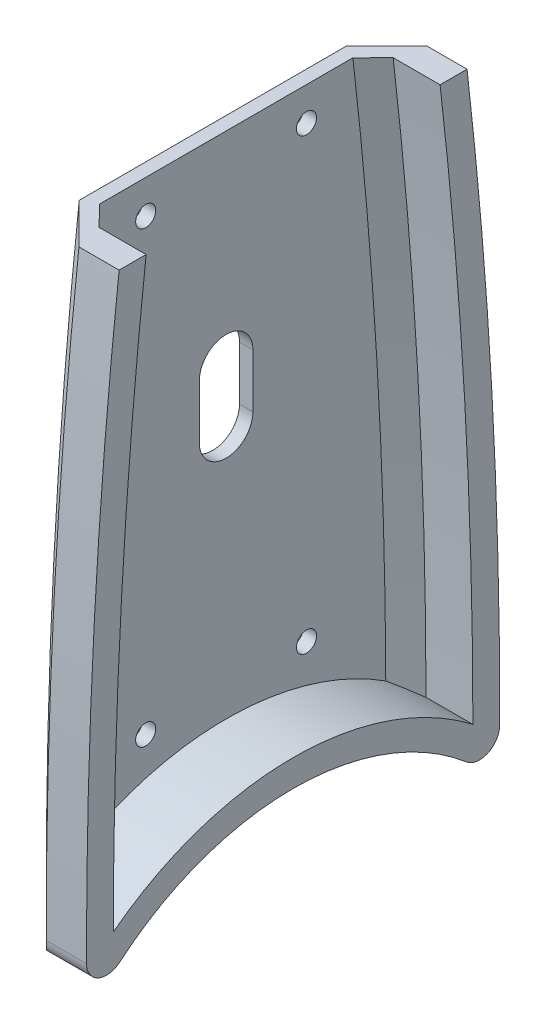
ISO-10303-21;
HEADER;
FILE_DESCRIPTION(('STEP AP214'),'2;1');
FILE_NAME('part.step','',(''),(''),'','','');
FILE_SCHEMA(('AUTOMOTIVE_DESIGN { 1 0 10303 214 1 1 1 1 }'));
ENDSEC;
DATA;
#1=APPLICATION_CONTEXT('core data for automotive mechanical design processes');
#2=APPLICATION_PROTOCOL_DEFINITION('international standard','automotive_design',2000,#1);
#3=PRODUCT_CONTEXT('',#1,'mechanical');
#4=PRODUCT('Part','Part','',(#3));
#5=PRODUCT_RELATED_PRODUCT_CATEGORY('part','',(#4));
#6=PRODUCT_DEFINITION_FORMATION('','',#4);
#7=PRODUCT_DEFINITION_CONTEXT('part definition',#1,'design');
#8=PRODUCT_DEFINITION('design','',#6,#7);
#9=PRODUCT_DEFINITION_SHAPE('','',#8);
#10=(LENGTH_UNIT() NAMED_UNIT(*) SI_UNIT(.MILLI.,.METRE.));
#11=(NAMED_UNIT(*) PLANE_ANGLE_UNIT() SI_UNIT($,.RADIAN.));
#12=(NAMED_UNIT(*) SI_UNIT($,.STERADIAN.) SOLID_ANGLE_UNIT());
#13=UNCERTAINTY_MEASURE_WITH_UNIT(LENGTH_MEASURE(1.E-05),#10,'distance_accuracy_value','');
#14=(GEOMETRIC_REPRESENTATION_CONTEXT(3) GLOBAL_UNCERTAINTY_ASSIGNED_CONTEXT((#13)) GLOBAL_UNIT_ASSIGNED_CONTEXT((#10,
#11,#12)) REPRESENTATION_CONTEXT('',''));
#15=CARTESIAN_POINT('',(0.,0.,0.));
#16=DIRECTION('',(0.,0.,1.));
#17=DIRECTION('',(1.,0.,0.));
#18=AXIS2_PLACEMENT_3D('',#15,#16,#17);
#19=CARTESIAN_POINT('',(2.,34.6875000000001,-719.163943300657));
#20=DIRECTION('',(-1.,0.,0.));
#21=DIRECTION('',(0.,0.,1.));
#22=AXIS2_PLACEMENT_3D('',#19,#20,#21);
#23=PLANE('',#22);
#24=CARTESIAN_POINT('',(2.,48.,-12.));
#25=DIRECTION('',(-1.,0.,0.));
#26=DIRECTION('',(0.,0.,1.));
#27=AXIS2_PLACEMENT_3D('',#24,#25,#26);
#28=CIRCLE('',#27,1.5);
#29=CARTESIAN_POINT('',(2.,48.,-10.5));
#30=VERTEX_POINT('',#29);
#31=EDGE_CURVE('E383',#30,#30,#28,.F.);
#32=ORIENTED_EDGE('',*,*,#31,.F.);
#33=EDGE_LOOP('',(#32));
#34=FACE_BOUND('',#33,.T.);
#35=CARTESIAN_POINT('',(2.,48.,12.));
#36=DIRECTION('',(-1.,0.,0.));
#37=DIRECTION('',(0.,0.,1.));
#38=AXIS2_PLACEMENT_3D('',#35,#36,#37);
#39=CIRCLE('',#38,1.5);
#40=CARTESIAN_POINT('',(2.,48.,13.5));
#41=VERTEX_POINT('',#40);
#42=EDGE_CURVE('E386',#41,#41,#39,.F.);
#43=ORIENTED_EDGE('',*,*,#42,.F.);
#44=EDGE_LOOP('',(#43));
#45=FACE_BOUND('',#44,.T.);
#46=CARTESIAN_POINT('',(2.,0.,0.));
#47=DIRECTION('',(1.,0.,0.));
#48=DIRECTION('',(0.,0.,1.));
#49=AXIS2_PLACEMENT_3D('',#46,#47,#48);
#50=CIRCLE('',#49,44.);
#51=CARTESIAN_POINT('',(2.,36.9866458379439,-23.8324994421171));
#52=VERTEX_POINT('',#51);
#53=CARTESIAN_POINT('',(2.,36.986645837944,23.832499442117));
#54=VERTEX_POINT('',#53);
#55=EDGE_CURVE('E188',#52,#54,#50,.T.);
#56=ORIENTED_EDGE('',*,*,#55,.F.);
#57=CARTESIAN_POINT('',(2.,34.6875000000001,719.163943300657));
#58=DIRECTION('',(-1.,0.,0.));
#59=DIRECTION('',(0.,0.,1.));
#60=AXIS2_PLACEMENT_3D('',#57,#58,#59);
#61=CIRCLE('',#60,743.);
#62=CARTESIAN_POINT('',(2.,120.,-18.9219442109188));
#63=VERTEX_POINT('',#62);
#64=EDGE_CURVE('E461',#52,#63,#61,.F.);
#65=ORIENTED_EDGE('',*,*,#64,.T.);
#66=DIRECTION('',(0.,0.,1.));
#67=VECTOR('',#66,1.);
#68=CARTESIAN_POINT('',(2.,120.,25.9681103272558));
#69=LINE('',#68,#67);
#70=CARTESIAN_POINT('',(2.,120.,18.9219442109186));
#71=VERTEX_POINT('',#70);
#72=EDGE_CURVE('E55',#63,#71,#69,.T.);
#73=ORIENTED_EDGE('',*,*,#72,.T.);
#74=CARTESIAN_POINT('',(2.,34.6875000000001,-719.163943300657));
#75=DIRECTION('',(-1.,0.,0.));
#76=DIRECTION('',(0.,0.,1.));
#77=AXIS2_PLACEMENT_3D('',#74,#75,#76);
#78=CIRCLE('',#77,743.);
#79=EDGE_CURVE('E335',#71,#54,#78,.F.);
#80=ORIENTED_EDGE('',*,*,#79,.T.);
#81=EDGE_LOOP('',(#56,#65,#73,#80));
#82=FACE_BOUND('',#81,.T.);
#83=CARTESIAN_POINT('',(2.,81.7,0.));
#84=DIRECTION('',(1.,0.,0.));
#85=DIRECTION('',(0.,0.,-1.));
#86=AXIS2_PLACEMENT_3D('',#83,#84,#85);
#87=CIRCLE('',#86,4.);
#88=CARTESIAN_POINT('',(2.,81.7,4.));
#89=VERTEX_POINT('',#88);
#90=CARTESIAN_POINT('',(2.,81.7,-4.));
#91=VERTEX_POINT('',#90);
#92=EDGE_CURVE('E205',#89,#91,#87,.T.);
#93=ORIENTED_EDGE('',*,*,#92,.F.);
#94=DIRECTION('',(0.,-1.,0.));
#95=VECTOR('',#94,1.);
#96=CARTESIAN_POINT('',(2.,89.7,4.));
#97=LINE('',#96,#95);
#98=CARTESIAN_POINT('',(2.,89.7,4.));
#99=VERTEX_POINT('',#98);
#100=EDGE_CURVE('E196',#99,#89,#97,.T.);
#101=ORIENTED_EDGE('',*,*,#100,.F.);
#102=CARTESIAN_POINT('',(2.,89.7,0.));
#103=DIRECTION('',(1.,0.,0.));
#104=DIRECTION('',(0.,0.,-1.));
#105=AXIS2_PLACEMENT_3D('',#102,#103,#104);
#106=CIRCLE('',#105,4.);
#107=CARTESIAN_POINT('',(2.,89.7,-4.));
#108=VERTEX_POINT('',#107);
#109=EDGE_CURVE('E193',#108,#99,#106,.T.);
#110=ORIENTED_EDGE('',*,*,#109,.F.);
#111=DIRECTION('',(0.,1.,0.));
#112=VECTOR('',#111,1.);
#113=CARTESIAN_POINT('',(2.,89.7,-4.));
#114=LINE('',#113,#112);
#115=EDGE_CURVE('E202',#91,#108,#114,.T.);
#116=ORIENTED_EDGE('',*,*,#115,.F.);
#117=EDGE_LOOP('',(#93,#101,#110,#116));
#118=FACE_BOUND('',#117,.T.);
#119=CARTESIAN_POINT('',(2.,115.,12.));
#120=DIRECTION('',(1.,0.,0.));
#121=DIRECTION('',(0.,0.,-1.));
#122=AXIS2_PLACEMENT_3D('',#119,#120,#121);
#123=CIRCLE('',#122,1.5);
#124=CARTESIAN_POINT('',(2.,115.,10.5));
#125=VERTEX_POINT('',#124);
#126=EDGE_CURVE('E237',#125,#125,#123,.T.);
#127=ORIENTED_EDGE('',*,*,#126,.F.);
#128=EDGE_LOOP('',(#127));
#129=FACE_BOUND('',#128,.T.);
#130=CARTESIAN_POINT('',(2.,115.,-12.));
#131=DIRECTION('',(1.,0.,0.));
#132=DIRECTION('',(0.,0.,-1.));
#133=AXIS2_PLACEMENT_3D('',#130,#131,#132);
#134=CIRCLE('',#133,1.5);
#135=CARTESIAN_POINT('',(2.,115.,-13.5));
#136=VERTEX_POINT('',#135);
#137=EDGE_CURVE('E231',#136,#136,#134,.T.);
#138=ORIENTED_EDGE('',*,*,#137,.F.);
#139=EDGE_LOOP('',(#138));
#140=FACE_BOUND('',#139,.T.);
#141=ADVANCED_FACE('F34',(#34,#45,#82,#118,#129,#140),#23,.F.);
#142=CARTESIAN_POINT('',(0.,34.6875000000001,-719.163943300657));
#143=DIRECTION('',(-1.,0.,0.));
#144=DIRECTION('',(0.,0.,1.));
#145=AXIS2_PLACEMENT_3D('',#142,#143,#144);
#146=PLANE('',#145);
#147=CARTESIAN_POINT('',(0.,48.,-12.));
#148=DIRECTION('',(-1.,0.,0.));
#149=DIRECTION('',(0.,0.,1.));
#150=AXIS2_PLACEMENT_3D('',#147,#148,#149);
#151=CIRCLE('',#150,1.5);
#152=CARTESIAN_POINT('',(0.,48.,-10.5));
#153=VERTEX_POINT('',#152);
#154=EDGE_CURVE('E487',#153,#153,#151,.T.);
#155=ORIENTED_EDGE('',*,*,#154,.F.);
#156=EDGE_LOOP('',(#155));
#157=FACE_BOUND('',#156,.T.);
#158=CARTESIAN_POINT('',(0.,48.,12.));
#159=DIRECTION('',(-1.,0.,0.));
#160=DIRECTION('',(0.,0.,1.));
#161=AXIS2_PLACEMENT_3D('',#158,#159,#160);
#162=CIRCLE('',#161,1.5);
#163=CARTESIAN_POINT('',(0.,48.,13.5));
#164=VERTEX_POINT('',#163);
#165=EDGE_CURVE('E488',#164,#164,#162,.T.);
#166=ORIENTED_EDGE('',*,*,#165,.F.);
#167=EDGE_LOOP('',(#166));
#168=FACE_BOUND('',#167,.T.);
#169=DIRECTION('',(0.,-1.,0.));
#170=VECTOR('',#169,1.);
#171=CARTESIAN_POINT('',(0.,89.7,4.));
#172=LINE('',#171,#170);
#173=CARTESIAN_POINT('',(0.,89.7,4.));
#174=VERTEX_POINT('',#173);
#175=CARTESIAN_POINT('',(0.,81.7,4.));
#176=VERTEX_POINT('',#175);
#177=EDGE_CURVE('E204',#174,#176,#172,.T.);
#178=ORIENTED_EDGE('',*,*,#177,.T.);
#179=CARTESIAN_POINT('',(0.,81.7,0.));
#180=DIRECTION('',(-1.,0.,0.));
#181=DIRECTION('',(0.,0.,1.));
#182=AXIS2_PLACEMENT_3D('',#179,#180,#181);
#183=CIRCLE('',#182,4.);
#184=CARTESIAN_POINT('',(0.,81.7,-4.));
#185=VERTEX_POINT('',#184);
#186=EDGE_CURVE('E222',#176,#185,#183,.F.);
#187=ORIENTED_EDGE('',*,*,#186,.T.);
#188=DIRECTION('',(0.,1.,0.));
#189=VECTOR('',#188,1.);
#190=CARTESIAN_POINT('',(0.,89.7,-4.));
#191=LINE('',#190,#189);
#192=CARTESIAN_POINT('',(0.,89.7,-4.));
#193=VERTEX_POINT('',#192);
#194=EDGE_CURVE('E218',#185,#193,#191,.T.);
#195=ORIENTED_EDGE('',*,*,#194,.T.);
#196=CARTESIAN_POINT('',(0.,89.7,0.));
#197=DIRECTION('',(-1.,0.,0.));
#198=DIRECTION('',(0.,0.,1.));
#199=AXIS2_PLACEMENT_3D('',#196,#197,#198);
#200=CIRCLE('',#199,4.);
#201=EDGE_CURVE('E213',#193,#174,#200,.F.);
#202=ORIENTED_EDGE('',*,*,#201,.T.);
#203=EDGE_LOOP('',(#178,#187,#195,#202));
#204=FACE_BOUND('',#203,.T.);
#205=CARTESIAN_POINT('',(0.,115.,12.));
#206=DIRECTION('',(1.,0.,0.));
#207=DIRECTION('',(0.,0.,-1.));
#208=AXIS2_PLACEMENT_3D('',#205,#206,#207);
#209=CIRCLE('',#208,1.5);
#210=CARTESIAN_POINT('',(0.,115.,10.5));
#211=VERTEX_POINT('',#210);
#212=EDGE_CURVE('E234',#211,#211,#209,.T.);
#213=ORIENTED_EDGE('',*,*,#212,.T.);
#214=EDGE_LOOP('',(#213));
#215=FACE_BOUND('',#214,.T.);
#216=DIRECTION('',(0.,0.,1.));
#217=VECTOR('',#216,1.);
#218=CARTESIAN_POINT('',(0.,120.,25.9681103272558));
#219=LINE('',#218,#217);
#220=CARTESIAN_POINT('',(0.,120.,-19.9285930868716));
#221=VERTEX_POINT('',#220);
#222=CARTESIAN_POINT('',(0.,120.,19.9285930868714));
#223=VERTEX_POINT('',#222);
#224=EDGE_CURVE('E245',#221,#223,#219,.T.);
#225=ORIENTED_EDGE('',*,*,#224,.F.);
#226=CARTESIAN_POINT('',(0.,34.6875000000001,719.163943300657));
#227=DIRECTION('',(-1.,0.,0.));
#228=DIRECTION('',(0.,0.,1.));
#229=AXIS2_PLACEMENT_3D('',#226,#227,#228);
#230=CIRCLE('',#229,744.);
#231=CARTESIAN_POINT('',(0.,31.3614337611449,-24.8286220408086));
#232=VERTEX_POINT('',#231);
#233=EDGE_CURVE('E408',#221,#232,#230,.T.);
#234=ORIENTED_EDGE('',*,*,#233,.T.);
#235=CARTESIAN_POINT('',(0.,0.,0.));
#236=DIRECTION('',(-1.,0.,0.));
#237=DIRECTION('',(0.,0.,1.));
#238=AXIS2_PLACEMENT_3D('',#235,#236,#237);
#239=CIRCLE('',#238,40.);
#240=CARTESIAN_POINT('',(0.,31.361433761145,24.8286220408084));
#241=VERTEX_POINT('',#240);
#242=EDGE_CURVE('E240',#241,#232,#239,.T.);
#243=ORIENTED_EDGE('',*,*,#242,.F.);
#244=CARTESIAN_POINT('',(0.,34.6875000000001,-719.163943300657));
#245=DIRECTION('',(-1.,0.,0.));
#246=DIRECTION('',(0.,0.,1.));
#247=AXIS2_PLACEMENT_3D('',#244,#245,#246);
#248=CIRCLE('',#247,744.);
#249=EDGE_CURVE('E410',#241,#223,#248,.T.);
#250=ORIENTED_EDGE('',*,*,#249,.T.);
#251=EDGE_LOOP('',(#225,#234,#243,#250));
#252=FACE_BOUND('',#251,.T.);
#253=CARTESIAN_POINT('',(0.,115.,-12.));
#254=DIRECTION('',(1.,0.,0.));
#255=DIRECTION('',(0.,0.,-1.));
#256=AXIS2_PLACEMENT_3D('',#253,#254,#255);
#257=CIRCLE('',#256,1.5);
#258=CARTESIAN_POINT('',(0.,115.,-13.5));
#259=VERTEX_POINT('',#258);
#260=EDGE_CURVE('E230',#259,#259,#257,.T.);
#261=ORIENTED_EDGE('',*,*,#260,.T.);
#262=EDGE_LOOP('',(#261));
#263=FACE_BOUND('',#262,.T.);
#264=ADVANCED_FACE('F294',(#157,#168,#204,#215,#252,#263),#146,.T.);
#265=CARTESIAN_POINT('',(2.,34.6875000000001,-719.163943300657));
#266=DIRECTION('',(-1.,0.,0.));
#267=DIRECTION('',(0.,0.,1.));
#268=AXIS2_PLACEMENT_3D('',#265,#266,#267);
#269=CYLINDRICAL_SURFACE('',#268,750.);
#270=DIRECTION('',(-1.,0.,0.));
#271=VECTOR('',#270,1.);
#272=CARTESIAN_POINT('',(2.,120.,25.9681103272558));
#273=LINE('',#272,#271);
#274=CARTESIAN_POINT('',(12.,120.,25.9681103272555));
#275=VERTEX_POINT('',#274);
#276=CARTESIAN_POINT('',(6.,120.,25.9681103272558));
#277=VERTEX_POINT('',#276);
#278=EDGE_CURVE('E244',#275,#277,#273,.T.);
#279=ORIENTED_EDGE('',*,*,#278,.T.);
#280=CARTESIAN_POINT('',(6.,34.6875000000001,-719.163943300657));
#281=DIRECTION('',(-1.,0.,0.));
#282=DIRECTION('',(0.,0.,1.));
#283=AXIS2_PLACEMENT_3D('',#280,#281,#282);
#284=CIRCLE('',#283,750.);
#285=CARTESIAN_POINT('',(6.,32.7686888838703,30.8336021379272));
#286=VERTEX_POINT('',#285);
#287=EDGE_CURVE('E452',#277,#286,#284,.F.);
#288=ORIENTED_EDGE('',*,*,#287,.T.);
#289=DIRECTION('',(-1.,0.,0.));
#290=VECTOR('',#289,1.);
#291=CARTESIAN_POINT('',(2.,32.7686888838703,30.8336021379272));
#292=LINE('',#291,#290);
#293=CARTESIAN_POINT('',(12.,32.7686888838706,30.8336021379271));
#294=VERTEX_POINT('',#293);
#295=EDGE_CURVE('E264',#294,#286,#292,.T.);
#296=ORIENTED_EDGE('',*,*,#295,.F.);
#297=CARTESIAN_POINT('',(12.,34.6875000000001,-719.163943300657));
#298=DIRECTION('',(1.,0.,0.));
#299=DIRECTION('',(0.,0.,-1.));
#300=AXIS2_PLACEMENT_3D('',#297,#298,#299);
#301=CIRCLE('',#300,750.);
#302=EDGE_CURVE('E481',#275,#294,#301,.T.);
#303=ORIENTED_EDGE('',*,*,#302,.F.);
#304=EDGE_LOOP('',(#279,#288,#296,#303));
#305=FACE_BOUND('',#304,.T.);
#306=ADVANCED_FACE('F378',(#305),#269,.T.);
#307=CARTESIAN_POINT('',(2.,32.7763641283348,27.8336119561728));
#308=DIRECTION('',(-1.,0.,0.));
#309=DIRECTION('',(0.,0.,1.));
#310=AXIS2_PLACEMENT_3D('',#307,#308,#309);
#311=CYLINDRICAL_SURFACE('',#310,3.);
#312=ORIENTED_EDGE('',*,*,#295,.T.);
#313=CARTESIAN_POINT('',(6.,32.7686888838703,30.8336021379272));
#314=CARTESIAN_POINT('',(6.00001664767935,32.7013448719441,30.8334465996863));
#315=CARTESIAN_POINT('',(5.9977420229501,32.6340195892035,30.8309905451029));
#316=CARTESIAN_POINT('',(5.9887384341797,32.5000319553376,30.8216080301197));
#317=CARTESIAN_POINT('',(5.9820129254935,32.4333691306425,30.8146850376423));
#318=CARTESIAN_POINT('',(5.96431067323062,32.3017851075527,30.7965756296147));
#319=CARTESIAN_POINT('',(5.9533704076342,32.2368539417847,30.7854258094019));
#320=CARTESIAN_POINT('',(5.92746771141412,32.1086443951743,30.7590930524039));
#321=CARTESIAN_POINT('',(5.91250471248808,32.0453662492453,30.7439095457727));
#322=CARTESIAN_POINT('',(5.86207244477978,31.8590155054294,30.6928048511367));
#323=CARTESIAN_POINT('',(5.82098983150369,31.7389275341459,30.6512578492043));
#324=CARTESIAN_POINT('',(5.7263130414485,31.5090226833747,30.5556410129186));
#325=CARTESIAN_POINT('',(5.67269067832951,31.3992297352458,30.5015429690404));
#326=CARTESIAN_POINT('',(5.53160587749576,31.1487652429428,30.3593232630704));
#327=CARTESIAN_POINT('',(5.43923947309864,31.0136320074971,30.2663014455629));
#328=CARTESIAN_POINT('',(5.24040044010448,30.7661487452022,30.0662056831701));
#329=CARTESIAN_POINT('',(5.13390169385607,30.6538419004485,29.9591057243412));
#330=CARTESIAN_POINT('',(4.8681689544096,30.412039919487,29.6920341748139));
#331=CARTESIAN_POINT('',(4.70439888298465,30.292529445998,29.5275629026063));
#332=CARTESIAN_POINT('',(4.36549268828183,30.0919294749543,29.1874458134862));
#333=CARTESIAN_POINT('',(4.19034289250906,30.0108872042131,29.0117865596364));
#334=CARTESIAN_POINT('',(3.89969930081388,29.9079683665275,28.7204848356058));
#335=CARTESIAN_POINT('',(3.78607260862913,29.8752947599445,28.6066457152498));
#336=CARTESIAN_POINT('',(3.55722448592159,29.8237317048292,28.3774591092181));
#337=CARTESIAN_POINT('',(3.44200264760484,29.8048458499645,28.2621112382671));
#338=CARTESIAN_POINT('',(3.09477736454976,29.7684171782828,27.914640252045));
#339=CARTESIAN_POINT('',(2.86141725270223,29.7711730818516,27.6812933257478));
#340=CARTESIAN_POINT('',(2.51335965492097,29.816008073376,27.3335213510443));
#341=CARTESIAN_POINT('',(2.39720165821484,29.8379101484779,27.2175039932376));
#342=CARTESIAN_POINT('',(2.16651274650422,29.8957984743741,26.9871842788535));
#343=CARTESIAN_POINT('',(2.05198237861278,29.9317893501325,26.8728824982598));
#344=CARTESIAN_POINT('',(1.82616254043301,30.0181256071349,26.6476035774748));
#345=CARTESIAN_POINT('',(1.71486101846643,30.0684070723862,26.5366140123644));
#346=CARTESIAN_POINT('',(1.49626550424913,30.184011332607,26.318721653177));
#347=CARTESIAN_POINT('',(1.38896719143882,30.2493173321247,26.2118144499998));
#348=CARTESIAN_POINT('',(1.24755582118878,30.3483711397838,26.0709807774261));
#349=CARTESIAN_POINT('',(1.21099193614153,30.3752123278807,26.0345721574045));
#350=CARTESIAN_POINT('',(1.1386444124115,30.4309059213567,25.9625436584811));
#351=CARTESIAN_POINT('',(1.10286063885939,30.4597579754095,25.9269236432248));
#352=CARTESIAN_POINT('',(1.06750123418277,30.4896410496135,25.8917320522537));
#353=B_SPLINE_CURVE_WITH_KNOTS('',3,(#313,#314,#315,#316,#317,#318,#319,#320,#321,#322,#323,
#324,#325,#326,#327,#328,#329,#330,#331,#332,#333,#334,#335,#336,#337,#338,#339,#340,#341,#342,
#343,#344,#345,#346,#347,#348,#349,#350,#351,#352),.UNSPECIFIED.,.F.,.F.,(4,2,2,2,2,2,2,2,2,2,2,
2,2,2,2,2,2,2,2,4),(0.,0.201934562953001,0.40371254164895,0.603782037441311,0.803879812457379,
1.20256881281007,1.60216273320594,2.1638352445812,2.7265606146136,3.50557324555117,
4.28553980028182,4.77734504123833,5.26927842159179,6.25402262391494,6.7504574010632,
7.24705528088741,7.7414661199683,8.23532693543146,8.40978024857283,8.58420315831425),.UNSPECIFIED.);
#354=CARTESIAN_POINT('',(1.06750123418289,30.4896410496138,25.8917320522538));
#355=VERTEX_POINT('',#354);
#356=EDGE_CURVE('E446',#286,#355,#353,.T.);
#357=ORIENTED_EDGE('',*,*,#356,.T.);
#358=DIRECTION('',(-1.,0.,0.));
#359=VECTOR('',#358,1.);
#360=CARTESIAN_POINT('',(2.,30.4896410496138,25.8917320522538));
#361=LINE('',#360,#359);
#362=CARTESIAN_POINT('',(12.,30.4896410496138,25.8917320522538));
#363=VERTEX_POINT('',#362);
#364=EDGE_CURVE('E261',#363,#355,#361,.T.);
#365=ORIENTED_EDGE('',*,*,#364,.F.);
#366=CARTESIAN_POINT('',(12.,32.7763641283348,27.8336119561728));
#367=DIRECTION('',(1.,0.,0.));
#368=DIRECTION('',(0.,0.,-1.));
#369=AXIS2_PLACEMENT_3D('',#366,#367,#368);
#370=CIRCLE('',#369,2.99999999999995);
#371=EDGE_CURVE('E478',#294,#363,#370,.T.);
#372=ORIENTED_EDGE('',*,*,#371,.F.);
#373=EDGE_LOOP('',(#312,#357,#365,#372));
#374=FACE_BOUND('',#373,.T.);
#375=ADVANCED_FACE('F437',(#374),#311,.T.);
#376=CARTESIAN_POINT('',(2.,0.,0.));
#377=DIRECTION('',(-1.,0.,0.));
#378=DIRECTION('',(0.,0.,1.));
#379=AXIS2_PLACEMENT_3D('',#376,#377,#378);
#380=CYLINDRICAL_SURFACE('',#379,40.);
#381=ORIENTED_EDGE('',*,*,#242,.T.);
#382=CARTESIAN_POINT('',(0.,31.3614337611452,-24.8286220408088));
#383=CARTESIAN_POINT('',(0.179412816507268,31.2199167447072,-25.0074061210049));
#384=CARTESIAN_POINT('',(0.358077660919323,31.0765088438804,-25.1853906620333));
#385=CARTESIAN_POINT('',(0.713911405647698,30.785911273372,-25.5397606658491));
#386=CARTESIAN_POINT('',(0.891080305963222,30.6387216036883,-25.7161461286357));
#387=CARTESIAN_POINT('',(1.06750123418274,30.4896410496139,-25.8917320522537));
#388=B_SPLINE_CURVE_WITH_KNOTS('',3,(#382,#383,#384,#385,#386,#387),.UNSPECIFIED.,.F.,.F.,(4,2,
4),(0.,0.870338466023901,1.74067693251102),.UNSPECIFIED.);
#389=CARTESIAN_POINT('',(1.06750123418265,30.4896410496139,-25.8917320522537));
#390=VERTEX_POINT('',#389);
#391=EDGE_CURVE('E417',#232,#390,#388,.T.);
#392=ORIENTED_EDGE('',*,*,#391,.T.);
#393=DIRECTION('',(-1.,0.,0.));
#394=VECTOR('',#393,1.);
#395=CARTESIAN_POINT('',(2.,30.4896410496139,-25.8917320522537));
#396=LINE('',#395,#394);
#397=CARTESIAN_POINT('',(12.,30.4896410496139,-25.8917320522538));
#398=VERTEX_POINT('',#397);
#399=EDGE_CURVE('E258',#398,#390,#396,.T.);
#400=ORIENTED_EDGE('',*,*,#399,.F.);
#401=CARTESIAN_POINT('',(12.,0.,0.));
#402=DIRECTION('',(-1.,0.,0.));
#403=DIRECTION('',(0.,0.,-1.));
#404=AXIS2_PLACEMENT_3D('',#401,#402,#403);
#405=CIRCLE('',#404,40.);
#406=EDGE_CURVE('E475',#363,#398,#405,.T.);
#407=ORIENTED_EDGE('',*,*,#406,.F.);
#408=ORIENTED_EDGE('',*,*,#364,.T.);
#409=CARTESIAN_POINT('',(1.06750123418289,30.4896410496138,25.8917320522538));
#410=CARTESIAN_POINT('',(0.891080305963319,30.6387216036883,25.7161461286358));
#411=CARTESIAN_POINT('',(0.713911405647753,30.785911273372,25.5397606658492));
#412=CARTESIAN_POINT('',(0.358077660919325,31.0765088438804,25.1853906620332));
#413=CARTESIAN_POINT('',(0.179412816507258,31.2199167447071,25.0074061210047));
#414=CARTESIAN_POINT('',(0.,31.361433761145,24.8286220408084));
#415=B_SPLINE_CURVE_WITH_KNOTS('',3,(#409,#410,#411,#412,#413,#414),.UNSPECIFIED.,.F.,.F.,(4,2,
4),(0.,0.870338466487304,1.74067693251138),.UNSPECIFIED.);
#416=EDGE_CURVE('E418',#355,#241,#415,.T.);
#417=ORIENTED_EDGE('',*,*,#416,.T.);
#418=EDGE_LOOP('',(#381,#392,#400,#407,#408,#417));
#419=FACE_BOUND('',#418,.T.);
#420=ADVANCED_FACE('F432',(#419),#380,.F.);
#421=CARTESIAN_POINT('',(2.,32.7763641283349,-27.8336119561728));
#422=DIRECTION('',(-1.,0.,0.));
#423=DIRECTION('',(0.,0.,1.));
#424=AXIS2_PLACEMENT_3D('',#421,#422,#423);
#425=CYLINDRICAL_SURFACE('',#424,3.);
#426=ORIENTED_EDGE('',*,*,#399,.T.);
#427=CARTESIAN_POINT('',(1.06750123418265,30.4896410496139,-25.8917320522537));
#428=CARTESIAN_POINT('',(1.14509822637326,30.4240914107984,-25.9689606931884));
#429=CARTESIAN_POINT('',(1.22470927295541,30.3634781542057,-26.0482232094108));
#430=CARTESIAN_POINT('',(1.38709784330232,30.2517982752887,-26.2099584044706));
#431=CARTESIAN_POINT('',(1.46987179885149,30.2007212566712,-26.2924274676045));
#432=CARTESIAN_POINT('',(1.63750298996061,30.1078645501375,-26.4594971026821));
#433=CARTESIAN_POINT('',(1.72234859592079,30.0660422631497,-26.544085824932));
#434=CARTESIAN_POINT('',(1.89392362305431,29.991068280253,-26.7151958225656));
#435=CARTESIAN_POINT('',(1.98065369691074,29.9579196420167,-26.8017177678225));
#436=CARTESIAN_POINT('',(2.2574627669443,29.8662694587914,-27.0779480522957));
#437=CARTESIAN_POINT('',(2.45015292589036,29.823262975299,-27.270360941092));
#438=CARTESIAN_POINT('',(2.83827488286668,29.7751104184725,-27.6581759167978));
#439=CARTESIAN_POINT('',(3.03371325008792,29.7700802119597,-27.8535853304836));
#440=CARTESIAN_POINT('',(3.3453316163247,29.7924575635345,-28.165357109366));
#441=CARTESIAN_POINT('',(3.46204097123937,29.8077304060924,-28.2821691705969));
#442=CARTESIAN_POINT('',(3.69413277701382,29.8522711099568,-28.514555323095));
#443=CARTESIAN_POINT('',(3.8095148477129,29.8815428834227,-28.6301290590618));
#444=CARTESIAN_POINT('',(4.03775806205184,29.9544346974419,-28.8588417535626));
#445=CARTESIAN_POINT('',(4.1506231812804,29.9980301019685,-28.9719845397195));
#446=CARTESIAN_POINT('',(4.37282765989904,30.1001528014471,-29.1948263377659));
#447=CARTESIAN_POINT('',(4.48216905799552,30.1586712811401,-29.3045273399471));
#448=CARTESIAN_POINT('',(4.7249947971955,30.3094342086348,-29.5482562153224));
#449=CARTESIAN_POINT('',(4.85699910166686,30.4065203138383,-29.680827488979));
#450=CARTESIAN_POINT('',(5.10906045477738,30.6278633470783,-29.9341251736811));
#451=CARTESIAN_POINT('',(5.22913524386742,30.7520790232435,-30.0548691692614));
#452=CARTESIAN_POINT('',(5.42536877127507,30.9964051890966,-30.2523431665426));
#453=CARTESIAN_POINT('',(5.50520544457083,31.1105723127473,-30.3327369701533));
#454=CARTESIAN_POINT('',(5.65102199002403,31.3555807608276,-30.4796841016526));
#455=CARTESIAN_POINT('',(5.71701777561283,31.4864026552617,-30.5462533233537));
#456=CARTESIAN_POINT('',(5.8203036087778,31.7373005073636,-30.6505649199364));
#457=CARTESIAN_POINT('',(5.86065093854616,31.8548382352883,-30.6913672377369));
#458=CARTESIAN_POINT('',(5.9269569977038,32.0977534812941,-30.7585518401544));
#459=CARTESIAN_POINT('',(5.95294534939881,32.2231142610563,-30.7849638102159));
#460=CARTESIAN_POINT('',(5.98048654446948,32.4194346532627,-30.8131169060937));
#461=CARTESIAN_POINT('',(5.98778104411375,32.4888368704267,-30.820618164107));
#462=CARTESIAN_POINT('',(5.99754515882351,32.6283718760785,-30.8307784374555));
#463=CARTESIAN_POINT('',(6.00001187804186,32.6985050776953,-30.8334345464605));
#464=CARTESIAN_POINT('',(5.99999999999992,32.76868888387,-30.8336021379271));
#465=B_SPLINE_CURVE_WITH_KNOTS('',3,(#427,#428,#429,#430,#431,#432,#433,#434,#435,#436,#437,
#438,#439,#440,#441,#442,#443,#444,#445,#446,#447,#448,#449,#450,#451,#452,#453,#454,#455,#456,
#457,#458,#459,#460,#461,#462,#463,#464),.UNSPECIFIED.,.F.,.F.,(4,2,2,2,2,2,2,2,2,2,2,2,2,2,2,2,
2,2,4),(0.,0.382561543753112,0.764703556558892,1.14504820562965,1.52552675537606,
2.34956360420391,3.17611360336116,3.67307773272653,4.17018082555397,4.66643335957371,
5.16239342691822,5.7926545628586,6.42196394567427,6.90282703993652,7.38313419815359,
7.77396427884475,8.16398504481941,8.37424108156137,8.58462319755949),.UNSPECIFIED.);
#466=CARTESIAN_POINT('',(6.,32.76868888387,-30.8336021379271));
#467=VERTEX_POINT('',#466);
#468=EDGE_CURVE('E693',#390,#467,#465,.T.);
#469=ORIENTED_EDGE('',*,*,#468,.T.);
#470=DIRECTION('',(-1.,0.,0.));
#471=VECTOR('',#470,1.);
#472=CARTESIAN_POINT('',(2.,32.76868888387,-30.8336021379271));
#473=LINE('',#472,#471);
#474=CARTESIAN_POINT('',(12.,32.76868888387,-30.8336021379271));
#475=VERTEX_POINT('',#474);
#476=EDGE_CURVE('E255',#475,#467,#473,.T.);
#477=ORIENTED_EDGE('',*,*,#476,.F.);
#478=CARTESIAN_POINT('',(12.,32.7763641283349,-27.8336119561728));
#479=DIRECTION('',(1.,0.,0.));
#480=DIRECTION('',(0.,0.,-1.));
#481=AXIS2_PLACEMENT_3D('',#478,#479,#480);
#482=CIRCLE('',#481,2.99999999999998);
#483=EDGE_CURVE('E472',#398,#475,#482,.T.);
#484=ORIENTED_EDGE('',*,*,#483,.F.);
#485=EDGE_LOOP('',(#426,#469,#477,#484));
#486=FACE_BOUND('',#485,.T.);
#487=ADVANCED_FACE('F436',(#486),#425,.T.);
#488=CARTESIAN_POINT('',(2.,34.6875000000001,719.163943300657));
#489=DIRECTION('',(-1.,0.,0.));
#490=DIRECTION('',(0.,0.,1.));
#491=AXIS2_PLACEMENT_3D('',#488,#489,#490);
#492=CYLINDRICAL_SURFACE('',#491,750.);
#493=ORIENTED_EDGE('',*,*,#476,.T.);
#494=CARTESIAN_POINT('',(6.,34.6875000000001,719.163943300657));
#495=DIRECTION('',(-1.,0.,0.));
#496=DIRECTION('',(0.,0.,1.));
#497=AXIS2_PLACEMENT_3D('',#494,#495,#496);
#498=CIRCLE('',#497,750.);
#499=CARTESIAN_POINT('',(6.,120.,-25.9681103272558));
#500=VERTEX_POINT('',#499);
#501=EDGE_CURVE('E267',#467,#500,#498,.F.);
#502=ORIENTED_EDGE('',*,*,#501,.T.);
#503=DIRECTION('',(-1.,0.,0.));
#504=VECTOR('',#503,1.);
#505=CARTESIAN_POINT('',(2.,120.,-25.9681103272558));
#506=LINE('',#505,#504);
#507=CARTESIAN_POINT('',(12.,120.,-25.9681103272558));
#508=VERTEX_POINT('',#507);
#509=EDGE_CURVE('E252',#508,#500,#506,.T.);
#510=ORIENTED_EDGE('',*,*,#509,.F.);
#511=CARTESIAN_POINT('',(12.,34.6875000000001,719.163943300657));
#512=DIRECTION('',(1.,0.,0.));
#513=DIRECTION('',(0.,0.,-1.));
#514=AXIS2_PLACEMENT_3D('',#511,#512,#513);
#515=CIRCLE('',#514,750.);
#516=EDGE_CURVE('E470',#475,#508,#515,.T.);
#517=ORIENTED_EDGE('',*,*,#516,.F.);
#518=EDGE_LOOP('',(#493,#502,#510,#517));
#519=FACE_BOUND('',#518,.T.);
#520=ADVANCED_FACE('F292',(#519),#492,.T.);
#521=CARTESIAN_POINT('',(2.,120.,25.9681103272558));
#522=DIRECTION('',(0.,-1.,0.));
#523=DIRECTION('',(0.,0.,-1.));
#524=AXIS2_PLACEMENT_3D('',#521,#522,#523);
#525=PLANE('',#524);
#526=DIRECTION('',(-1.,0.,0.));
#527=VECTOR('',#526,1.);
#528=CARTESIAN_POINT('',(12.,120.,21.9418368304593));
#529=LINE('',#528,#527);
#530=CARTESIAN_POINT('',(12.,120.,21.9418368304593));
#531=VERTEX_POINT('',#530);
#532=CARTESIAN_POINT('',(5.,120.,21.9418368304593));
#533=VERTEX_POINT('',#532);
#534=EDGE_CURVE('E198',#531,#533,#529,.T.);
#535=ORIENTED_EDGE('',*,*,#534,.T.);
#536=CARTESIAN_POINT('',(5.,120.,21.9418368304593));
#537=CARTESIAN_POINT('',(4.49999325370178,120.,21.4385280957283));
#538=CARTESIAN_POINT('',(3.99998988055269,120.,20.9352160100678));
#539=CARTESIAN_POINT('',(2.99998988055269,120.,19.9285851368876));
#540=CARTESIAN_POINT('',(2.49999325370177,120.,19.4252663493679));
#541=CARTESIAN_POINT('',(1.99999999999998,120.,18.9219442109187));
#542=B_SPLINE_CURVE_WITH_KNOTS('',3,(#536,#537,#538,#539,#540,#541),.UNSPECIFIED.,.F.,.F.,(4,2,
4),(0.,2.12836506703893,4.25673013407824),.UNSPECIFIED.);
#543=EDGE_CURVE('E11',#533,#71,#542,.T.);
#544=ORIENTED_EDGE('',*,*,#543,.T.);
#545=ORIENTED_EDGE('',*,*,#72,.F.);
#546=CARTESIAN_POINT('',(2.,120.,-18.9219442109188));
#547=CARTESIAN_POINT('',(2.49999325370178,120.,-19.425266349368));
#548=CARTESIAN_POINT('',(2.99998988055269,120.,-19.9285851368877));
#549=CARTESIAN_POINT('',(3.99998988055271,120.,-20.9352160100679));
#550=CARTESIAN_POINT('',(4.4999932537018,120.,-21.4385280957284));
#551=CARTESIAN_POINT('',(5.00000000000003,120.,-21.9418368304593));
#552=B_SPLINE_CURVE_WITH_KNOTS('',3,(#546,#547,#548,#549,#550,#551),.UNSPECIFIED.,.F.,.F.,(4,2,
4),(0.,2.12836506703931,4.25673013407823),.UNSPECIFIED.);
#553=CARTESIAN_POINT('',(5.,120.,-21.9418368304594));
#554=VERTEX_POINT('',#553);
#555=EDGE_CURVE('E48',#63,#554,#552,.T.);
#556=ORIENTED_EDGE('',*,*,#555,.T.);
#557=DIRECTION('',(-1.,0.,0.));
#558=VECTOR('',#557,1.);
#559=CARTESIAN_POINT('',(12.,120.,-21.9418368304594));
#560=LINE('',#559,#558);
#561=CARTESIAN_POINT('',(12.,120.,-21.9418368304594));
#562=VERTEX_POINT('',#561);
#563=EDGE_CURVE('E62',#562,#554,#560,.T.);
#564=ORIENTED_EDGE('',*,*,#563,.F.);
#565=DIRECTION('',(0.,0.,1.));
#566=VECTOR('',#565,1.);
#567=CARTESIAN_POINT('',(12.,120.,-25.9681103272558));
#568=LINE('',#567,#566);
#569=EDGE_CURVE('E187',#508,#562,#568,.T.);
#570=ORIENTED_EDGE('',*,*,#569,.F.);
#571=ORIENTED_EDGE('',*,*,#509,.T.);
#572=CARTESIAN_POINT('',(6.,120.,-25.9681103272557));
#573=CARTESIAN_POINT('',(4.99997328805917,120.,-24.961550657688));
#574=CARTESIAN_POINT('',(3.99995993208911,120.,-23.9549777195392));
#575=CARTESIAN_POINT('',(1.99995993208911,120.,-21.9418053060778));
#576=CARTESIAN_POINT('',(0.999973288059177,120.,-20.9352058307652));
#577=CARTESIAN_POINT('',(0.,120.,-19.9285930868715));
#578=B_SPLINE_CURVE_WITH_KNOTS('',3,(#572,#573,#574,#575,#576,#577),.UNSPECIFIED.,.F.,.F.,(4,2,
4),(0.,4.25663507096727,8.51327014194055),.UNSPECIFIED.);
#579=CARTESIAN_POINT('',(2.,120.,-21.9418368304594));
#580=VERTEX_POINT('',#579);
#581=EDGE_CURVE('E308',#500,#580,#578,.T.);
#582=ORIENTED_EDGE('',*,*,#581,.T.);
#583=CARTESIAN_POINT('',(6.,120.,-25.9681103272557));
#584=CARTESIAN_POINT('',(4.99997328805917,120.,-24.961550657688));
#585=CARTESIAN_POINT('',(3.99995993208911,120.,-23.9549777195392));
#586=CARTESIAN_POINT('',(1.99995993208911,120.,-21.9418053060778));
#587=CARTESIAN_POINT('',(0.999973288059177,120.,-20.9352058307652));
#588=CARTESIAN_POINT('',(0.,120.,-19.9285930868715));
#589=B_SPLINE_CURVE_WITH_KNOTS('',3,(#583,#584,#585,#586,#587,#588),.UNSPECIFIED.,.F.,.F.,(4,2,
4),(0.,4.25663507096727,8.51327014194055),.UNSPECIFIED.);
#590=EDGE_CURVE('E302',#580,#221,#589,.T.);
#591=ORIENTED_EDGE('',*,*,#590,.T.);
#592=ORIENTED_EDGE('',*,*,#224,.T.);
#593=CARTESIAN_POINT('',(0.,120.,19.9285930868714));
#594=CARTESIAN_POINT('',(0.999973288059148,120.,20.9352058307652));
#595=CARTESIAN_POINT('',(1.99995993208908,120.,21.9418053060778));
#596=CARTESIAN_POINT('',(3.99995993208909,120.,23.9549777195391));
#597=CARTESIAN_POINT('',(4.99997328805917,120.,24.961550657688));
#598=CARTESIAN_POINT('',(6.00000000000003,120.,25.9681103272556));
#599=B_SPLINE_CURVE_WITH_KNOTS('',3,(#593,#594,#595,#596,#597,#598),.UNSPECIFIED.,.F.,.F.,(4,2,
4),(0.,4.25663507097333,8.51327014194063),.UNSPECIFIED.);
#600=CARTESIAN_POINT('',(2.,120.,21.9418368304592));
#601=VERTEX_POINT('',#600);
#602=EDGE_CURVE('E277',#223,#601,#599,.T.);
#603=ORIENTED_EDGE('',*,*,#602,.T.);
#604=CARTESIAN_POINT('',(0.,120.,19.9285930868714));
#605=CARTESIAN_POINT('',(0.999973288059148,120.,20.9352058307652));
#606=CARTESIAN_POINT('',(1.99995993208908,120.,21.9418053060778));
#607=CARTESIAN_POINT('',(3.99995993208909,120.,23.9549777195391));
#608=CARTESIAN_POINT('',(4.99997328805917,120.,24.961550657688));
#609=CARTESIAN_POINT('',(6.00000000000003,120.,25.9681103272556));
#610=B_SPLINE_CURVE_WITH_KNOTS('',3,(#604,#605,#606,#607,#608,#609),.UNSPECIFIED.,.F.,.F.,(4,2,
4),(0.,4.25663507097333,8.51327014194063),.UNSPECIFIED.);
#611=EDGE_CURVE('E270',#601,#277,#610,.T.);
#612=ORIENTED_EDGE('',*,*,#611,.T.);
#613=ORIENTED_EDGE('',*,*,#278,.F.);
#614=DIRECTION('',(0.,0.,1.));
#615=VECTOR('',#614,1.);
#616=CARTESIAN_POINT('',(12.,120.,25.9681103272555));
#617=LINE('',#616,#615);
#618=EDGE_CURVE('E465',#531,#275,#617,.T.);
#619=ORIENTED_EDGE('',*,*,#618,.F.);
#620=EDGE_LOOP('',(#535,#544,#545,#556,#564,#570,#571,#582,#591,#592,#603,#612,#613,#619));
#621=FACE_BOUND('',#620,.T.);
#622=ADVANCED_FACE('F286',(#621),#525,.F.);
#623=CARTESIAN_POINT('',(2.,115.,12.));
#624=DIRECTION('',(-1.,0.,0.));
#625=DIRECTION('',(0.,0.,1.));
#626=AXIS2_PLACEMENT_3D('',#623,#624,#625);
#627=CYLINDRICAL_SURFACE('',#626,1.5);
#628=ORIENTED_EDGE('',*,*,#126,.T.);
#629=EDGE_LOOP('',(#628));
#630=FACE_BOUND('',#629,.T.);
#631=ORIENTED_EDGE('',*,*,#212,.F.);
#632=EDGE_LOOP('',(#631));
#633=FACE_BOUND('',#632,.T.);
#634=ADVANCED_FACE('F291',(#630,#633),#627,.F.);
#635=CARTESIAN_POINT('',(2.,115.,-12.));
#636=DIRECTION('',(-1.,0.,0.));
#637=DIRECTION('',(0.,0.,1.));
#638=AXIS2_PLACEMENT_3D('',#635,#636,#637);
#639=CYLINDRICAL_SURFACE('',#638,1.5);
#640=ORIENTED_EDGE('',*,*,#137,.T.);
#641=EDGE_LOOP('',(#640));
#642=FACE_BOUND('',#641,.T.);
#643=ORIENTED_EDGE('',*,*,#260,.F.);
#644=EDGE_LOOP('',(#643));
#645=FACE_BOUND('',#644,.T.);
#646=ADVANCED_FACE('F366',(#642,#645),#639,.F.);
#647=CARTESIAN_POINT('',(-17.8885438199983,89.7,4.));
#648=DIRECTION('',(0.,0.,1.));
#649=DIRECTION('',(0.,-1.,0.));
#650=AXIS2_PLACEMENT_3D('',#647,#648,#649);
#651=PLANE('',#650);
#652=DIRECTION('',(1.,0.,0.));
#653=VECTOR('',#652,1.);
#654=CARTESIAN_POINT('',(-17.8885438199983,89.7,4.));
#655=LINE('',#654,#653);
#656=EDGE_CURVE('E216',#174,#99,#655,.T.);
#657=ORIENTED_EDGE('',*,*,#656,.T.);
#658=ORIENTED_EDGE('',*,*,#100,.T.);
#659=DIRECTION('',(1.,0.,0.));
#660=VECTOR('',#659,1.);
#661=CARTESIAN_POINT('',(-17.8885438199983,81.7,4.));
#662=LINE('',#661,#660);
#663=EDGE_CURVE('E212',#176,#89,#662,.T.);
#664=ORIENTED_EDGE('',*,*,#663,.F.);
#665=ORIENTED_EDGE('',*,*,#177,.F.);
#666=EDGE_LOOP('',(#657,#658,#664,#665));
#667=FACE_BOUND('',#666,.T.);
#668=ADVANCED_FACE('F362',(#667),#651,.F.);
#669=CARTESIAN_POINT('',(-17.8885438199983,81.7,0.));
#670=DIRECTION('',(1.,0.,0.));
#671=DIRECTION('',(0.,0.,-1.));
#672=AXIS2_PLACEMENT_3D('',#669,#670,#671);
#673=CYLINDRICAL_SURFACE('',#672,4.);
#674=ORIENTED_EDGE('',*,*,#663,.T.);
#675=ORIENTED_EDGE('',*,*,#92,.T.);
#676=DIRECTION('',(1.,0.,0.));
#677=VECTOR('',#676,1.);
#678=CARTESIAN_POINT('',(-17.8885438199983,81.7,-4.));
#679=LINE('',#678,#677);
#680=EDGE_CURVE('E221',#185,#91,#679,.T.);
#681=ORIENTED_EDGE('',*,*,#680,.F.);
#682=ORIENTED_EDGE('',*,*,#186,.F.);
#683=EDGE_LOOP('',(#674,#675,#681,#682));
#684=FACE_BOUND('',#683,.T.);
#685=ADVANCED_FACE('F358',(#684),#673,.F.);
#686=CARTESIAN_POINT('',(-17.8885438199983,89.7,-4.));
#687=DIRECTION('',(0.,0.,-1.));
#688=DIRECTION('',(0.,1.,0.));
#689=AXIS2_PLACEMENT_3D('',#686,#687,#688);
#690=PLANE('',#689);
#691=ORIENTED_EDGE('',*,*,#680,.T.);
#692=ORIENTED_EDGE('',*,*,#115,.T.);
#693=DIRECTION('',(1.,0.,0.));
#694=VECTOR('',#693,1.);
#695=CARTESIAN_POINT('',(-17.8885438199983,89.7,-4.));
#696=LINE('',#695,#694);
#697=EDGE_CURVE('E217',#193,#108,#696,.T.);
#698=ORIENTED_EDGE('',*,*,#697,.F.);
#699=ORIENTED_EDGE('',*,*,#194,.F.);
#700=EDGE_LOOP('',(#691,#692,#698,#699));
#701=FACE_BOUND('',#700,.T.);
#702=ADVANCED_FACE('F354',(#701),#690,.F.);
#703=CARTESIAN_POINT('',(-17.8885438199983,89.7,0.));
#704=DIRECTION('',(1.,0.,0.));
#705=DIRECTION('',(0.,0.,-1.));
#706=AXIS2_PLACEMENT_3D('',#703,#704,#705);
#707=CYLINDRICAL_SURFACE('',#706,4.);
#708=ORIENTED_EDGE('',*,*,#697,.T.);
#709=ORIENTED_EDGE('',*,*,#109,.T.);
#710=ORIENTED_EDGE('',*,*,#656,.F.);
#711=ORIENTED_EDGE('',*,*,#201,.F.);
#712=EDGE_LOOP('',(#708,#709,#710,#711));
#713=FACE_BOUND('',#712,.T.);
#714=ADVANCED_FACE('F351',(#713),#707,.F.);
#715=CARTESIAN_POINT('',(12.,34.6875000000001,719.163943300657));
#716=DIRECTION('',(-1.,0.,0.));
#717=DIRECTION('',(0.,0.,1.));
#718=AXIS2_PLACEMENT_3D('',#715,#716,#717);
#719=CYLINDRICAL_SURFACE('',#718,746.);
#720=ORIENTED_EDGE('',*,*,#563,.T.);
#721=CARTESIAN_POINT('',(5.,34.6875000000001,719.163943300657));
#722=DIRECTION('',(-1.,0.,0.));
#723=DIRECTION('',(0.,0.,1.));
#724=AXIS2_PLACEMENT_3D('',#721,#722,#723);
#725=CIRCLE('',#724,746.);
#726=CARTESIAN_POINT('',(5.,34.8687143746748,-26.8360346895243));
#727=VERTEX_POINT('',#726);
#728=EDGE_CURVE('E192',#554,#727,#725,.T.);
#729=ORIENTED_EDGE('',*,*,#728,.T.);
#730=DIRECTION('',(-1.,0.,0.));
#731=VECTOR('',#730,1.);
#732=CARTESIAN_POINT('',(12.,34.8687143746748,-26.8360346895243));
#733=LINE('',#732,#731);
#734=CARTESIAN_POINT('',(12.,34.8687143746748,-26.8360346895243));
#735=VERTEX_POINT('',#734);
#736=EDGE_CURVE('E176',#735,#727,#733,.T.);
#737=ORIENTED_EDGE('',*,*,#736,.F.);
#738=CARTESIAN_POINT('',(12.,34.6875000000001,719.163943300657));
#739=DIRECTION('',(-1.,0.,0.));
#740=DIRECTION('',(0.,0.,-1.));
#741=AXIS2_PLACEMENT_3D('',#738,#739,#740);
#742=CIRCLE('',#741,746.);
#743=EDGE_CURVE('E182',#562,#735,#742,.T.);
#744=ORIENTED_EDGE('',*,*,#743,.F.);
#745=EDGE_LOOP('',(#720,#729,#737,#744));
#746=FACE_BOUND('',#745,.T.);
#747=ADVANCED_FACE('F190',(#746),#719,.F.);
#748=CARTESIAN_POINT('',(12.,0.,0.));
#749=DIRECTION('',(-1.,0.,0.));
#750=DIRECTION('',(0.,0.,1.));
#751=AXIS2_PLACEMENT_3D('',#748,#749,#750);
#752=CYLINDRICAL_SURFACE('',#751,44.);
#753=ORIENTED_EDGE('',*,*,#736,.T.);
#754=CARTESIAN_POINT('',(5.,34.8687143746748,-26.8360346895244));
#755=CARTESIAN_POINT('',(4.75439290919483,35.0577758876185,-26.5903815695246));
#756=CARTESIAN_POINT('',(4.50760392884922,35.2436693735709,-26.3434756047807));
#757=CARTESIAN_POINT('',(4.01185063787128,35.6091125156479,-25.847359783886));
#758=CARTESIAN_POINT('',(3.76288702685447,35.7886641246327,-25.5981506673014));
#759=CARTESIAN_POINT('',(3.26282083035564,36.1415326872388,-25.0974782034942));
#760=CARTESIAN_POINT('',(3.01171825042191,36.314849657026,-24.8460148621188));
#761=CARTESIAN_POINT('',(2.50739953150335,36.6553510622156,-24.3408716728149));
#762=CARTESIAN_POINT('',(2.25418275996006,36.8225335751396,-24.087191160371));
#763=CARTESIAN_POINT('',(2.00000000000001,36.9866458379439,-23.8324994421171));
#764=B_SPLINE_CURVE_WITH_KNOTS('',3,(#754,#755,#756,#757,#758,#759,#760,#761,#762,#763),
.UNSPECIFIED.,.F.,.F.,(4,2,2,2,4),(0.,1.18645107269018,2.37253355745198,3.55861296656376,
4.74506096066001),.UNSPECIFIED.);
#765=EDGE_CURVE('E327',#727,#52,#764,.T.);
#766=ORIENTED_EDGE('',*,*,#765,.T.);
#767=ORIENTED_EDGE('',*,*,#55,.T.);
#768=CARTESIAN_POINT('',(2.,36.986645837944,23.832499442117));
#769=CARTESIAN_POINT('',(2.25418275996006,36.8225335751397,24.0871911603709));
#770=CARTESIAN_POINT('',(2.50739953150334,36.6553510622157,24.3408716728148));
#771=CARTESIAN_POINT('',(3.01171825042191,36.314849657026,24.8460148621187));
#772=CARTESIAN_POINT('',(3.26282083035564,36.1415326872388,25.0974782034941));
#773=CARTESIAN_POINT('',(3.76288702685447,35.7886641246328,25.5981506673013));
#774=CARTESIAN_POINT('',(4.01185063787129,35.609112515648,25.8473597838859));
#775=CARTESIAN_POINT('',(4.50760392884922,35.243669373571,26.3434756047805));
#776=CARTESIAN_POINT('',(4.75439290919483,35.0577758876186,26.5903815695245));
#777=CARTESIAN_POINT('',(4.99999999999998,34.8687143746749,26.8360346895242));
#778=B_SPLINE_CURVE_WITH_KNOTS('',3,(#768,#769,#770,#771,#772,#773,#774,#775,#776,#777),
.UNSPECIFIED.,.F.,.F.,(4,2,2,2,4),(0.,1.18644799409623,2.37252740320801,3.5586098879698,
4.74506096065996),.UNSPECIFIED.);
#779=CARTESIAN_POINT('',(5.,34.8687143746749,26.8360346895242));
#780=VERTEX_POINT('',#779);
#781=EDGE_CURVE('E336',#54,#780,#778,.T.);
#782=ORIENTED_EDGE('',*,*,#781,.T.);
#783=DIRECTION('',(-1.,0.,0.));
#784=VECTOR('',#783,1.);
#785=CARTESIAN_POINT('',(12.,34.8687143746749,26.8360346895242));
#786=LINE('',#785,#784);
#787=CARTESIAN_POINT('',(12.,34.8687143746749,26.8360346895242));
#788=VERTEX_POINT('',#787);
#789=EDGE_CURVE('E178',#788,#780,#786,.T.);
#790=ORIENTED_EDGE('',*,*,#789,.F.);
#791=CARTESIAN_POINT('',(12.,0.,0.));
#792=DIRECTION('',(1.,0.,0.));
#793=DIRECTION('',(0.,0.,1.));
#794=AXIS2_PLACEMENT_3D('',#791,#792,#793);
#795=CIRCLE('',#794,44.);
#796=EDGE_CURVE('E172',#735,#788,#795,.T.);
#797=ORIENTED_EDGE('',*,*,#796,.F.);
#798=EDGE_LOOP('',(#753,#766,#767,#782,#790,#797));
#799=FACE_BOUND('',#798,.T.);
#800=ADVANCED_FACE('F174',(#799),#752,.T.);
#801=CARTESIAN_POINT('',(12.,34.6875000000001,-719.163943300657));
#802=DIRECTION('',(-1.,0.,0.));
#803=DIRECTION('',(0.,0.,1.));
#804=AXIS2_PLACEMENT_3D('',#801,#802,#803);
#805=CYLINDRICAL_SURFACE('',#804,746.);
#806=ORIENTED_EDGE('',*,*,#789,.T.);
#807=CARTESIAN_POINT('',(5.,34.6875000000001,-719.163943300657));
#808=DIRECTION('',(-1.,0.,0.));
#809=DIRECTION('',(0.,0.,1.));
#810=AXIS2_PLACEMENT_3D('',#807,#808,#809);
#811=CIRCLE('',#810,746.);
#812=EDGE_CURVE('E319',#780,#533,#811,.T.);
#813=ORIENTED_EDGE('',*,*,#812,.T.);
#814=ORIENTED_EDGE('',*,*,#534,.F.);
#815=CARTESIAN_POINT('',(12.,34.6875000000001,-719.163943300657));
#816=DIRECTION('',(-1.,0.,0.));
#817=DIRECTION('',(0.,0.,1.));
#818=AXIS2_PLACEMENT_3D('',#815,#816,#817);
#819=CIRCLE('',#818,746.);
#820=EDGE_CURVE('E181',#788,#531,#819,.T.);
#821=ORIENTED_EDGE('',*,*,#820,.F.);
#822=EDGE_LOOP('',(#806,#813,#814,#821));
#823=FACE_BOUND('',#822,.T.);
#824=ADVANCED_FACE('F346',(#823),#805,.F.);
#825=CARTESIAN_POINT('',(12.,34.6875000000001,719.163943300657));
#826=DIRECTION('',(1.,0.,0.));
#827=DIRECTION('',(0.,0.,-1.));
#828=AXIS2_PLACEMENT_3D('',#825,#826,#827);
#829=PLANE('',#828);
#830=ORIENTED_EDGE('',*,*,#743,.T.);
#831=ORIENTED_EDGE('',*,*,#796,.T.);
#832=ORIENTED_EDGE('',*,*,#820,.T.);
#833=ORIENTED_EDGE('',*,*,#618,.T.);
#834=ORIENTED_EDGE('',*,*,#302,.T.);
#835=ORIENTED_EDGE('',*,*,#371,.T.);
#836=ORIENTED_EDGE('',*,*,#406,.T.);
#837=ORIENTED_EDGE('',*,*,#483,.T.);
#838=ORIENTED_EDGE('',*,*,#516,.T.);
#839=ORIENTED_EDGE('',*,*,#569,.T.);
#840=EDGE_LOOP('',(#830,#831,#832,#833,#834,#835,#836,#837,#838,#839));
#841=FACE_BOUND('',#840,.T.);
#842=ADVANCED_FACE('F184',(#841),#829,.T.);
#843=CARTESIAN_POINT('',(6.24264068711929,48.,12.));
#844=DIRECTION('',(-1.,0.,0.));
#845=DIRECTION('',(0.,0.,1.));
#846=AXIS2_PLACEMENT_3D('',#843,#844,#845);
#847=CYLINDRICAL_SURFACE('',#846,1.5);
#848=ORIENTED_EDGE('',*,*,#42,.T.);
#849=EDGE_LOOP('',(#848));
#850=FACE_BOUND('',#849,.T.);
#851=ORIENTED_EDGE('',*,*,#165,.T.);
#852=EDGE_LOOP('',(#851));
#853=FACE_BOUND('',#852,.T.);
#854=ADVANCED_FACE('F505',(#850,#853),#847,.F.);
#855=CARTESIAN_POINT('',(6.24264068711929,48.,-12.));
#856=DIRECTION('',(-1.,0.,0.));
#857=DIRECTION('',(0.,0.,1.));
#858=AXIS2_PLACEMENT_3D('',#855,#856,#857);
#859=CYLINDRICAL_SURFACE('',#858,1.5);
#860=ORIENTED_EDGE('',*,*,#31,.T.);
#861=EDGE_LOOP('',(#860));
#862=FACE_BOUND('',#861,.T.);
#863=ORIENTED_EDGE('',*,*,#154,.T.);
#864=EDGE_LOOP('',(#863));
#865=FACE_BOUND('',#864,.T.);
#866=ADVANCED_FACE('F495',(#862,#865),#859,.F.);
#867=CARTESIAN_POINT('',(6.,34.6875000000001,719.163943300657));
#868=DIRECTION('',(1.,0.,0.));
#869=DIRECTION('',(0.,0.,-1.));
#870=AXIS2_PLACEMENT_3D('',#867,#868,#869);
#871=CONICAL_SURFACE('',#870,750.,0.785398163397458);
#872=ORIENTED_EDGE('',*,*,#391,.F.);
#873=ORIENTED_EDGE('',*,*,#233,.F.);
#874=ORIENTED_EDGE('',*,*,#590,.F.);
#875=ORIENTED_EDGE('',*,*,#581,.F.);
#876=ORIENTED_EDGE('',*,*,#501,.F.);
#877=ORIENTED_EDGE('',*,*,#468,.F.);
#878=EDGE_LOOP('',(#872,#873,#874,#875,#876,#877));
#879=FACE_BOUND('',#878,.T.);
#880=ADVANCED_FACE('F415',(#879),#871,.T.);
#881=CARTESIAN_POINT('',(6.,34.6875000000001,-719.163943300657));
#882=DIRECTION('',(1.,0.,0.));
#883=DIRECTION('',(0.,0.,-1.));
#884=AXIS2_PLACEMENT_3D('',#881,#882,#883);
#885=CONICAL_SURFACE('',#884,750.,0.785398163397467);
#886=ORIENTED_EDGE('',*,*,#602,.F.);
#887=ORIENTED_EDGE('',*,*,#249,.F.);
#888=ORIENTED_EDGE('',*,*,#416,.F.);
#889=ORIENTED_EDGE('',*,*,#356,.F.);
#890=ORIENTED_EDGE('',*,*,#287,.F.);
#891=ORIENTED_EDGE('',*,*,#611,.F.);
#892=EDGE_LOOP('',(#886,#887,#888,#889,#890,#891));
#893=FACE_BOUND('',#892,.T.);
#894=ADVANCED_FACE('F283',(#893),#885,.T.);
#895=CARTESIAN_POINT('',(5.,34.6875000000001,719.163943300657));
#896=DIRECTION('',(1.,0.,0.));
#897=DIRECTION('',(0.,0.,-1.));
#898=AXIS2_PLACEMENT_3D('',#895,#896,#897);
#899=CONICAL_SURFACE('',#898,746.,0.785398163397467);
#900=ORIENTED_EDGE('',*,*,#555,.F.);
#901=ORIENTED_EDGE('',*,*,#64,.F.);
#902=ORIENTED_EDGE('',*,*,#765,.F.);
#903=ORIENTED_EDGE('',*,*,#728,.F.);
#904=EDGE_LOOP('',(#900,#901,#902,#903));
#905=FACE_BOUND('',#904,.T.);
#906=ADVANCED_FACE('F321',(#905),#899,.F.);
#907=CARTESIAN_POINT('',(5.,34.6875000000001,-719.163943300657));
#908=DIRECTION('',(1.,0.,0.));
#909=DIRECTION('',(0.,0.,-1.));
#910=AXIS2_PLACEMENT_3D('',#907,#908,#909);
#911=CONICAL_SURFACE('',#910,746.,0.785398163397467);
#912=ORIENTED_EDGE('',*,*,#781,.F.);
#913=ORIENTED_EDGE('',*,*,#79,.F.);
#914=ORIENTED_EDGE('',*,*,#543,.F.);
#915=ORIENTED_EDGE('',*,*,#812,.F.);
#916=EDGE_LOOP('',(#912,#913,#914,#915));
#917=FACE_BOUND('',#916,.T.);
#918=ADVANCED_FACE('F36',(#917),#911,.F.);
#919=CLOSED_SHELL('',(#141,#264,#306,#375,#420,#487,#520,#622,#634,#646,#668,#685,#702,#714,
#747,#800,#824,#842,#854,#866,#880,#894,#906,#918));
#920=MANIFOLD_SOLID_BREP('B2',#919);
#921=ADVANCED_BREP_SHAPE_REPRESENTATION('',(#18,#920),#14);
#922=SHAPE_DEFINITION_REPRESENTATION(#9,#921);
ENDSEC;
END-ISO-10303-21;
